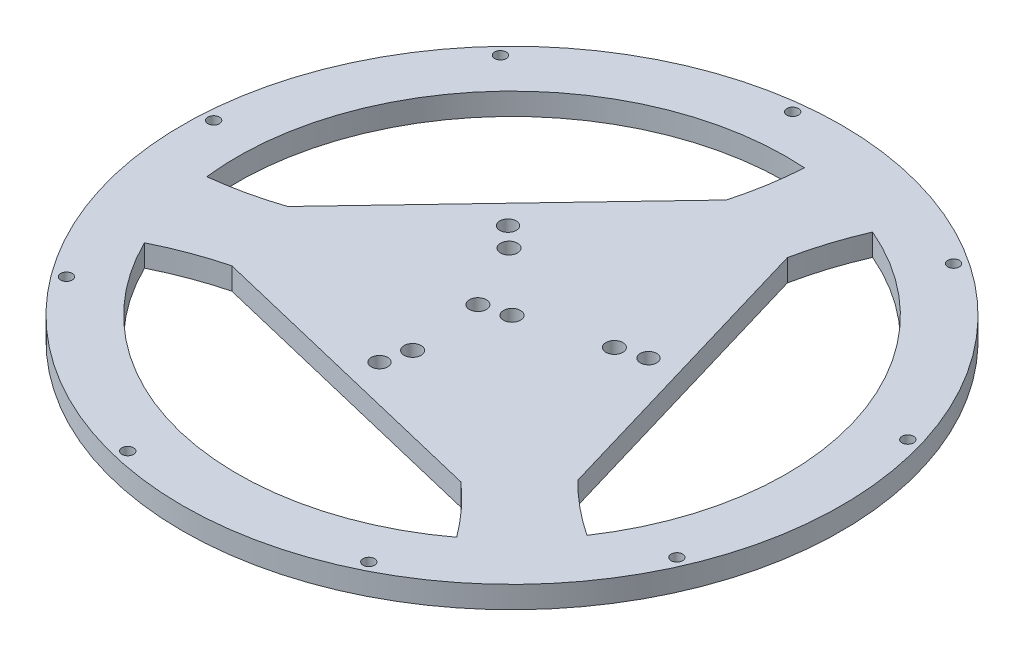
ISO-10303-21;
HEADER;
FILE_DESCRIPTION(('STEP AP214'),'2;1');
FILE_NAME('part.step','',(''),(''),'','','');
FILE_SCHEMA(('AUTOMOTIVE_DESIGN { 1 0 10303 214 1 1 1 1 }'));
ENDSEC;
DATA;
#1=APPLICATION_CONTEXT('core data for automotive mechanical design processes');
#2=APPLICATION_PROTOCOL_DEFINITION('international standard','automotive_design',2000,#1);
#3=PRODUCT_CONTEXT('',#1,'mechanical');
#4=PRODUCT('Part','Part','',(#3));
#5=PRODUCT_RELATED_PRODUCT_CATEGORY('part','',(#4));
#6=PRODUCT_DEFINITION_FORMATION('','',#4);
#7=PRODUCT_DEFINITION_CONTEXT('part definition',#1,'design');
#8=PRODUCT_DEFINITION('design','',#6,#7);
#9=PRODUCT_DEFINITION_SHAPE('','',#8);
#10=(LENGTH_UNIT() NAMED_UNIT(*) SI_UNIT(.MILLI.,.METRE.));
#11=(NAMED_UNIT(*) PLANE_ANGLE_UNIT() SI_UNIT($,.RADIAN.));
#12=(NAMED_UNIT(*) SI_UNIT($,.STERADIAN.) SOLID_ANGLE_UNIT());
#13=UNCERTAINTY_MEASURE_WITH_UNIT(LENGTH_MEASURE(1.E-05),#10,'distance_accuracy_value','');
#14=(GEOMETRIC_REPRESENTATION_CONTEXT(3) GLOBAL_UNCERTAINTY_ASSIGNED_CONTEXT((#13)) GLOBAL_UNIT_ASSIGNED_CONTEXT((#10,
#11,#12)) REPRESENTATION_CONTEXT('',''));
#15=CARTESIAN_POINT('',(0.,0.,0.));
#16=DIRECTION('',(0.,0.,1.));
#17=DIRECTION('',(1.,0.,0.));
#18=AXIS2_PLACEMENT_3D('',#15,#16,#17);
#19=CARTESIAN_POINT('',(0.,4.,0.));
#20=DIRECTION('',(0.,1.,0.));
#21=DIRECTION('',(0.,0.,1.));
#22=AXIS2_PLACEMENT_3D('',#19,#20,#21);
#23=PLANE('',#22);
#24=CARTESIAN_POINT('',(-57.8899742574897,4.,-3.5708375022087));
#25=DIRECTION('',(0.,1.,0.));
#26=DIRECTION('',(0.,0.,1.));
#27=AXIS2_PLACEMENT_3D('',#24,#25,#26);
#28=CIRCLE('',#27,1.05293502772648);
#29=CARTESIAN_POINT('',(-57.8899742574897,4.,-2.51790247448222));
#30=VERTEX_POINT('',#29);
#31=EDGE_CURVE('E515',#30,#30,#28,.F.);
#32=ORIENTED_EDGE('',*,*,#31,.T.);
#33=EDGE_LOOP('',(#32));
#34=FACE_BOUND('',#33,.T.);
#35=CARTESIAN_POINT('',(0.,4.,0.));
#36=DIRECTION('',(0.,1.,0.));
#37=DIRECTION('',(0.,0.,1.));
#38=AXIS2_PLACEMENT_3D('',#35,#36,#37);
#39=CIRCLE('',#38,1.55);
#40=CARTESIAN_POINT('',(0.,4.,1.55));
#41=VERTEX_POINT('',#40);
#42=EDGE_CURVE('E325',#41,#41,#39,.F.);
#43=ORIENTED_EDGE('',*,*,#42,.T.);
#44=EDGE_LOOP('',(#43));
#45=FACE_BOUND('',#44,.T.);
#46=CARTESIAN_POINT('',(-4.79483448116785,4.,1.41759031394963));
#47=DIRECTION('',(0.,1.,0.));
#48=DIRECTION('',(0.,0.,1.));
#49=AXIS2_PLACEMENT_3D('',#46,#47,#48);
#50=CIRCLE('',#49,1.55);
#51=CARTESIAN_POINT('',(-4.79483448116785,4.,2.96759031394963));
#52=VERTEX_POINT('',#51);
#53=EDGE_CURVE('E335',#52,#52,#50,.T.);
#54=ORIENTED_EDGE('',*,*,#53,.F.);
#55=EDGE_LOOP('',(#54));
#56=FACE_BOUND('',#55,.T.);
#57=CARTESIAN_POINT('',(-3.50924404963435,4.,14.5837308738232));
#58=DIRECTION('',(0.,1.,0.));
#59=DIRECTION('',(0.,0.,1.));
#60=AXIS2_PLACEMENT_3D('',#57,#58,#59);
#61=CIRCLE('',#60,1.55);
#62=CARTESIAN_POINT('',(-3.50924404963435,4.,16.1337308738232));
#63=VERTEX_POINT('',#62);
#64=EDGE_CURVE('E347',#63,#63,#61,.T.);
#65=ORIENTED_EDGE('',*,*,#64,.F.);
#66=EDGE_LOOP('',(#65));
#67=FACE_BOUND('',#66,.T.);
#68=CARTESIAN_POINT('',(53.1774832729495,4.,23.1550269435159));
#69=DIRECTION('',(0.,1.,0.));
#70=DIRECTION('',(0.,0.,1.));
#71=AXIS2_PLACEMENT_3D('',#68,#69,#70);
#72=CIRCLE('',#71,1.05293502772553);
#73=CARTESIAN_POINT('',(53.1774832729495,4.,24.2079619712414));
#74=VERTEX_POINT('',#73);
#75=EDGE_CURVE('E359',#74,#74,#72,.T.);
#76=ORIENTED_EDGE('',*,*,#75,.F.);
#77=EDGE_LOOP('',(#76));
#78=FACE_BOUND('',#77,.T.);
#79=CARTESIAN_POINT('',(-13.5690769919208,4.,56.3904260454485));
#80=DIRECTION('',(0.,1.,0.));
#81=DIRECTION('',(0.,0.,1.));
#82=AXIS2_PLACEMENT_3D('',#79,#80,#81);
#83=CIRCLE('',#82,1.05293502772525);
#84=CARTESIAN_POINT('',(-13.5690769919208,4.,57.4433610731738));
#85=VERTEX_POINT('',#84);
#86=EDGE_CURVE('E371',#85,#85,#83,.T.);
#87=ORIENTED_EDGE('',*,*,#86,.F.);
#88=EDGE_LOOP('',(#87));
#89=FACE_BOUND('',#88,.T.);
#90=CARTESIAN_POINT('',(-6.53590007807735,4.,-57.6305648954562));
#91=DIRECTION('',(0.,1.,0.));
#92=DIRECTION('',(0.,0.,1.));
#93=AXIS2_PLACEMENT_3D('',#90,#91,#92);
#94=CIRCLE('',#93,1.05293502772648);
#95=CARTESIAN_POINT('',(-6.53590007807735,4.,-56.5776298677297));
#96=VERTEX_POINT('',#95);
#97=EDGE_CURVE('E383',#96,#96,#94,.T.);
#98=ORIENTED_EDGE('',*,*,#97,.F.);
#99=EDGE_LOOP('',(#98));
#100=FACE_BOUND('',#99,.T.);
#101=CARTESIAN_POINT('',(55.6200799815454,4.,-16.4440476418153));
#102=DIRECTION('',(0.,1.,0.));
#103=DIRECTION('',(0.,0.,1.));
#104=AXIS2_PLACEMENT_3D('',#101,#102,#103);
#105=CIRCLE('',#104,1.05293502772614);
#106=CARTESIAN_POINT('',(55.6200799815454,4.,-15.3911126140892));
#107=VERTEX_POINT('',#106);
#108=EDGE_CURVE('E395',#107,#107,#105,.T.);
#109=ORIENTED_EDGE('',*,*,#108,.F.);
#110=EDGE_LOOP('',(#109));
#111=FACE_BOUND('',#110,.T.);
#112=CARTESIAN_POINT('',(-4.67899206617935,4.,19.444974498431));
#113=DIRECTION('',(0.,1.,0.));
#114=DIRECTION('',(0.,0.,1.));
#115=AXIS2_PLACEMENT_3D('',#112,#113,#114);
#116=CIRCLE('',#115,1.5);
#117=CARTESIAN_POINT('',(-4.67899206617935,4.,20.944974498431));
#118=VERTEX_POINT('',#117);
#119=EDGE_CURVE('E407',#118,#118,#116,.T.);
#120=ORIENTED_EDGE('',*,*,#119,.F.);
#121=EDGE_LOOP('',(#120));
#122=FACE_BOUND('',#121,.T.);
#123=CARTESIAN_POINT('',(0.,4.,0.));
#124=DIRECTION('',(0.,1.,0.));
#125=DIRECTION('',(0.,0.,1.));
#126=AXIS2_PLACEMENT_3D('',#123,#124,#125);
#127=CIRCLE('',#126,50.);
#128=CARTESIAN_POINT('',(41.5155711519758,4.,27.8649843338415));
#129=VERTEX_POINT('',#128);
#130=CARTESIAN_POINT('',(19.6892098874326,4.,-45.9601459311067));
#131=VERTEX_POINT('',#130);
#132=EDGE_CURVE('E453',#129,#131,#127,.T.);
#133=ORIENTED_EDGE('',*,*,#132,.F.);
#134=CARTESIAN_POINT('',(74.7395128137497,4.,-22.0966979882647));
#135=DIRECTION('',(0.,1.,0.));
#136=DIRECTION('',(0.,0.,1.));
#137=AXIS2_PLACEMENT_3D('',#134,#135,#136);
#138=CIRCLE('',#137,60.);
#139=CARTESIAN_POINT('',(31.9813255757251,4.,19.995313416728));
#140=VERTEX_POINT('',#139);
#141=EDGE_CURVE('E451',#140,#129,#138,.T.);
#142=ORIENTED_EDGE('',*,*,#141,.F.);
#143=DIRECTION('',(-0.28351806278993,0.,-0.958966896233569));
#144=VECTOR('',#143,1.);
#145=CARTESIAN_POINT('',(31.9813255757251,4.,19.995313416728));
#146=LINE('',#145,#144);
#147=CARTESIAN_POINT('',(15.967019235954,4.,-34.1712165562232));
#148=VERTEX_POINT('',#147);
#149=EDGE_CURVE('E459',#140,#148,#146,.T.);
#150=ORIENTED_EDGE('',*,*,#149,.T.);
#151=CARTESIAN_POINT('',(74.7395128137497,4.,-22.0966979882647));
#152=DIRECTION('',(0.,1.,0.));
#153=DIRECTION('',(0.,0.,1.));
#154=AXIS2_PLACEMENT_3D('',#151,#152,#153);
#155=CIRCLE('',#154,60.);
#156=EDGE_CURVE('E456',#131,#148,#155,.T.);
#157=ORIENTED_EDGE('',*,*,#156,.F.);
#158=EDGE_LOOP('',(#133,#142,#150,#157));
#159=FACE_BOUND('',#158,.T.);
#160=CARTESIAN_POINT('',(-14.5003458584922,4.,-13.7746132426325));
#161=DIRECTION('',(0.,1.,0.));
#162=DIRECTION('',(0.,0.,1.));
#163=AXIS2_PLACEMENT_3D('',#160,#161,#162);
#164=CIRCLE('',#163,1.5);
#165=CARTESIAN_POINT('',(-14.5003458584922,4.,-12.2746132426325));
#166=VERTEX_POINT('',#165);
#167=EDGE_CURVE('E483',#166,#166,#164,.T.);
#168=ORIENTED_EDGE('',*,*,#167,.F.);
#169=EDGE_LOOP('',(#168));
#170=FACE_BOUND('',#169,.T.);
#171=CARTESIAN_POINT('',(0.,4.,0.));
#172=DIRECTION('',(0.,1.,0.));
#173=DIRECTION('',(0.,0.,1.));
#174=AXIS2_PLACEMENT_3D('',#171,#172,#173);
#175=CIRCLE('',#174,60.);
#176=CARTESIAN_POINT('',(0.,4.,60.));
#177=VERTEX_POINT('',#176);
#178=EDGE_CURVE('E12',#177,#177,#175,.T.);
#179=ORIENTED_EDGE('',*,*,#178,.T.);
#180=EDGE_LOOP('',(#179));
#181=FACE_BOUND('',#180,.T.);
#182=CARTESIAN_POINT('',(-42.0510029896274,4.,-39.9463784036344));
#183=DIRECTION('',(0.,1.,0.));
#184=DIRECTION('',(0.,0.,1.));
#185=AXIS2_PLACEMENT_3D('',#182,#183,#184);
#186=CIRCLE('',#185,1.05293502772648);
#187=CARTESIAN_POINT('',(-42.0510029896274,4.,-38.8934433759079));
#188=VERTEX_POINT('',#187);
#189=EDGE_CURVE('E445',#188,#188,#186,.T.);
#190=ORIENTED_EDGE('',*,*,#189,.F.);
#191=EDGE_LOOP('',(#190));
#192=FACE_BOUND('',#191,.T.);
#193=CARTESIAN_POINT('',(0.,4.,0.));
#194=DIRECTION('',(0.,1.,0.));
#195=DIRECTION('',(0.,0.,1.));
#196=AXIS2_PLACEMENT_3D('',#193,#194,#195);
#197=CIRCLE('',#196,50.);
#198=CARTESIAN_POINT('',(-44.8895698851501,4.,22.0210471033105));
#199=VERTEX_POINT('',#198);
#200=CARTESIAN_POINT('',(29.9580489942619,4.,40.0314289085139));
#201=VERTEX_POINT('',#200);
#202=EDGE_CURVE('E415',#199,#201,#197,.T.);
#203=ORIENTED_EDGE('',*,*,#202,.F.);
#204=CARTESIAN_POINT('',(-18.2334546092855,4.,75.774665757312));
#205=DIRECTION('',(0.,1.,0.));
#206=DIRECTION('',(0.,0.,1.));
#207=AXIS2_PLACEMENT_3D('',#204,#205,#206);
#208=CIRCLE('',#207,60.);
#209=CARTESIAN_POINT('',(-33.3071121633809,4.,17.6989836869147));
#210=VERTEX_POINT('',#209);
#211=EDGE_CURVE('E413',#210,#199,#208,.T.);
#212=ORIENTED_EDGE('',*,*,#211,.F.);
#213=DIRECTION('',(0.972248724921551,0.,0.233949603308958));
#214=VECTOR('',#213,1.);
#215=CARTESIAN_POINT('',(-33.3071121633809,4.,17.6989836869147));
#216=LINE('',#215,#214);
#217=CARTESIAN_POINT('',(21.6096319979315,4.,30.9134525591627));
#218=VERTEX_POINT('',#217);
#219=EDGE_CURVE('E421',#210,#218,#216,.T.);
#220=ORIENTED_EDGE('',*,*,#219,.T.);
#221=CARTESIAN_POINT('',(-18.2334546092855,4.,75.774665757312));
#222=DIRECTION('',(0.,1.,0.));
#223=DIRECTION('',(0.,0.,1.));
#224=AXIS2_PLACEMENT_3D('',#221,#222,#223);
#225=CIRCLE('',#224,60.);
#226=EDGE_CURVE('E418',#201,#218,#225,.T.);
#227=ORIENTED_EDGE('',*,*,#226,.F.);
#228=EDGE_LOOP('',(#203,#212,#220,#227));
#229=FACE_BOUND('',#228,.T.);
#230=CARTESIAN_POINT('',(19.1793379246714,4.,-5.67036125579842));
#231=DIRECTION('',(0.,1.,0.));
#232=DIRECTION('',(0.,0.,1.));
#233=AXIS2_PLACEMENT_3D('',#230,#231,#232);
#234=CIRCLE('',#233,1.5);
#235=CARTESIAN_POINT('',(19.1793379246714,4.,-4.17036125579842));
#236=VERTEX_POINT('',#235);
#237=EDGE_CURVE('E401',#236,#236,#234,.T.);
#238=ORIENTED_EDGE('',*,*,#237,.F.);
#239=EDGE_LOOP('',(#238));
#240=FACE_BOUND('',#239,.T.);
#241=CARTESIAN_POINT('',(32.037423118442,4.,-48.3487695803088));
#242=DIRECTION('',(0.,1.,0.));
#243=DIRECTION('',(0.,0.,1.));
#244=AXIS2_PLACEMENT_3D('',#241,#242,#243);
#245=CIRCLE('',#244,1.05293502772665);
#246=CARTESIAN_POINT('',(32.037423118442,4.,-47.2958345525821));
#247=VERTEX_POINT('',#246);
#248=EDGE_CURVE('E389',#247,#247,#245,.T.);
#249=ORIENTED_EDGE('',*,*,#248,.F.);
#250=EDGE_LOOP('',(#249));
#251=FACE_BOUND('',#250,.T.);
#252=CARTESIAN_POINT('',(-46.6415831948744,4.,34.4755379519386));
#253=DIRECTION('',(0.,1.,0.));
#254=DIRECTION('',(0.,0.,1.));
#255=AXIS2_PLACEMENT_3D('',#252,#253,#254);
#256=CIRCLE('',#255,1.05293502772574);
#257=CARTESIAN_POINT('',(-46.6415831948744,4.,35.5284729796644));
#258=VERTEX_POINT('',#257);
#259=EDGE_CURVE('E377',#258,#258,#256,.T.);
#260=ORIENTED_EDGE('',*,*,#259,.F.);
#261=EDGE_LOOP('',(#260));
#262=FACE_BOUND('',#261,.T.);
#263=CARTESIAN_POINT('',(25.8525511390449,4.,51.9196070825162));
#264=DIRECTION('',(0.,1.,0.));
#265=DIRECTION('',(0.,0.,1.));
#266=AXIS2_PLACEMENT_3D('',#263,#264,#265);
#267=CIRCLE('',#266,1.05293502772513);
#268=CARTESIAN_POINT('',(25.8525511390449,4.,52.9725421102413));
#269=VERTEX_POINT('',#268);
#270=EDGE_CURVE('E365',#269,#269,#267,.T.);
#271=ORIENTED_EDGE('',*,*,#270,.F.);
#272=EDGE_LOOP('',(#271));
#273=FACE_BOUND('',#272,.T.);
#274=CARTESIAN_POINT('',(-10.8752593938691,4.,-10.3309599319745));
#275=DIRECTION('',(0.,1.,0.));
#276=DIRECTION('',(0.,0.,1.));
#277=AXIS2_PLACEMENT_3D('',#274,#275,#276);
#278=CIRCLE('',#277,1.55);
#279=CARTESIAN_POINT('',(-10.8752593938691,4.,-8.78095993197445));
#280=VERTEX_POINT('',#279);
#281=EDGE_CURVE('E353',#280,#280,#278,.T.);
#282=ORIENTED_EDGE('',*,*,#281,.F.);
#283=EDGE_LOOP('',(#282));
#284=FACE_BOUND('',#283,.T.);
#285=CARTESIAN_POINT('',(14.3845034435036,4.,-4.2527709418489));
#286=DIRECTION('',(0.,1.,0.));
#287=DIRECTION('',(0.,0.,1.));
#288=AXIS2_PLACEMENT_3D('',#285,#286,#287);
#289=CIRCLE('',#288,1.55);
#290=CARTESIAN_POINT('',(14.3845034435036,4.,-2.7027709418489));
#291=VERTEX_POINT('',#290);
#292=EDGE_CURVE('E341',#291,#291,#289,.T.);
#293=ORIENTED_EDGE('',*,*,#292,.F.);
#294=EDGE_LOOP('',(#293));
#295=FACE_BOUND('',#294,.T.);
#296=DIRECTION('',(-0.688730662131619,0.,0.725017292924618));
#297=VECTOR('',#296,1.);
#298=CARTESIAN_POINT('',(-18.1254323231156,4.,-17.2182665532906));
#299=LINE('',#298,#297);
#300=CARTESIAN_POINT('',(1.32578658765488,4.,-37.6942971036422));
#301=VERTEX_POINT('',#300);
#302=CARTESIAN_POINT('',(-37.5766512338855,4.,3.25776399706044));
#303=VERTEX_POINT('',#302);
#304=EDGE_CURVE('E309',#301,#303,#299,.T.);
#305=ORIENTED_EDGE('',*,*,#304,.T.);
#306=CARTESIAN_POINT('',(-56.5060582044648,4.,-53.6779677690472));
#307=DIRECTION('',(0.,1.,0.));
#308=DIRECTION('',(0.,0.,1.));
#309=AXIS2_PLACEMENT_3D('',#306,#307,#308);
#310=CIRCLE('',#309,59.9999999999999);
#311=CARTESIAN_POINT('',(-49.6472588816947,4.,5.92871702259306));
#312=VERTEX_POINT('',#311);
#313=EDGE_CURVE('E319',#312,#303,#310,.T.);
#314=ORIENTED_EDGE('',*,*,#313,.F.);
#315=CARTESIAN_POINT('',(0.,4.,0.));
#316=DIRECTION('',(0.,1.,0.));
#317=DIRECTION('',(0.,0.,1.));
#318=AXIS2_PLACEMENT_3D('',#315,#316,#317);
#319=CIRCLE('',#318,50.);
#320=CARTESIAN_POINT('',(3.37399873317395,4.,-49.8860314371522));
#321=VERTEX_POINT('',#320);
#322=EDGE_CURVE('E317',#321,#312,#319,.T.);
#323=ORIENTED_EDGE('',*,*,#322,.F.);
#324=CARTESIAN_POINT('',(-56.5060582044648,4.,-53.6779677690472));
#325=DIRECTION('',(0.,1.,0.));
#326=DIRECTION('',(0.,0.,1.));
#327=AXIS2_PLACEMENT_3D('',#324,#325,#326);
#328=CIRCLE('',#327,60.);
#329=EDGE_CURVE('E301',#301,#321,#328,.T.);
#330=ORIENTED_EDGE('',*,*,#329,.F.);
#331=EDGE_LOOP('',(#305,#314,#323,#330));
#332=FACE_BOUND('',#331,.T.);
#333=ADVANCED_FACE('F208',(#34,#45,#56,#67,#78,#89,#100,#111,#122,#159,#170,#181,#192,#229,#240,
#251,#262,#273,#284,#295,#332),#23,.T.);
#334=CARTESIAN_POINT('',(0.,0.,0.));
#335=DIRECTION('',(0.,1.,0.));
#336=DIRECTION('',(0.,0.,1.));
#337=AXIS2_PLACEMENT_3D('',#334,#335,#336);
#338=PLANE('',#337);
#339=CARTESIAN_POINT('',(-57.8899742574897,0.,-3.5708375022087));
#340=DIRECTION('',(0.,1.,0.));
#341=DIRECTION('',(0.,0.,1.));
#342=AXIS2_PLACEMENT_3D('',#339,#340,#341);
#343=CIRCLE('',#342,1.05293502772648);
#344=CARTESIAN_POINT('',(-57.8899742574897,0.,-2.51790247448222));
#345=VERTEX_POINT('',#344);
#346=EDGE_CURVE('E808',#345,#345,#343,.T.);
#347=ORIENTED_EDGE('',*,*,#346,.T.);
#348=EDGE_LOOP('',(#347));
#349=FACE_BOUND('',#348,.T.);
#350=CARTESIAN_POINT('',(0.,0.,0.));
#351=DIRECTION('',(0.,1.,0.));
#352=DIRECTION('',(0.,0.,1.));
#353=AXIS2_PLACEMENT_3D('',#350,#351,#352);
#354=CIRCLE('',#353,1.55);
#355=CARTESIAN_POINT('',(0.,0.,1.55));
#356=VERTEX_POINT('',#355);
#357=EDGE_CURVE('E810',#356,#356,#354,.T.);
#358=ORIENTED_EDGE('',*,*,#357,.T.);
#359=EDGE_LOOP('',(#358));
#360=FACE_BOUND('',#359,.T.);
#361=CARTESIAN_POINT('',(-42.0510029896274,0.,-39.9463784036344));
#362=DIRECTION('',(0.,1.,0.));
#363=DIRECTION('',(0.,0.,1.));
#364=AXIS2_PLACEMENT_3D('',#361,#362,#363);
#365=CIRCLE('',#364,1.05293502772648);
#366=CARTESIAN_POINT('',(-42.0510029896274,0.,-38.8934433759079));
#367=VERTEX_POINT('',#366);
#368=EDGE_CURVE('E444',#367,#367,#365,.T.);
#369=ORIENTED_EDGE('',*,*,#368,.T.);
#370=EDGE_LOOP('',(#369));
#371=FACE_BOUND('',#370,.T.);
#372=CARTESIAN_POINT('',(74.7395128137497,0.,-22.0966979882647));
#373=DIRECTION('',(0.,1.,0.));
#374=DIRECTION('',(0.,0.,1.));
#375=AXIS2_PLACEMENT_3D('',#372,#373,#374);
#376=CIRCLE('',#375,60.);
#377=CARTESIAN_POINT('',(31.9813255757251,0.,19.995313416728));
#378=VERTEX_POINT('',#377);
#379=CARTESIAN_POINT('',(41.5155711519758,0.,27.8649843338415));
#380=VERTEX_POINT('',#379);
#381=EDGE_CURVE('E448',#378,#380,#376,.T.);
#382=ORIENTED_EDGE('',*,*,#381,.T.);
#383=CARTESIAN_POINT('',(0.,0.,0.));
#384=DIRECTION('',(0.,1.,0.));
#385=DIRECTION('',(0.,0.,1.));
#386=AXIS2_PLACEMENT_3D('',#383,#384,#385);
#387=CIRCLE('',#386,50.);
#388=CARTESIAN_POINT('',(19.6892098874326,0.,-45.9601459311067));
#389=VERTEX_POINT('',#388);
#390=EDGE_CURVE('E465',#380,#389,#387,.T.);
#391=ORIENTED_EDGE('',*,*,#390,.T.);
#392=CARTESIAN_POINT('',(74.7395128137497,0.,-22.0966979882647));
#393=DIRECTION('',(0.,1.,0.));
#394=DIRECTION('',(0.,0.,1.));
#395=AXIS2_PLACEMENT_3D('',#392,#393,#394);
#396=CIRCLE('',#395,60.);
#397=CARTESIAN_POINT('',(15.967019235954,0.,-34.1712165562232));
#398=VERTEX_POINT('',#397);
#399=EDGE_CURVE('E468',#389,#398,#396,.T.);
#400=ORIENTED_EDGE('',*,*,#399,.T.);
#401=DIRECTION('',(-0.28351806278993,0.,-0.958966896233569));
#402=VECTOR('',#401,1.);
#403=CARTESIAN_POINT('',(31.9813255757251,0.,19.995313416728));
#404=LINE('',#403,#402);
#405=EDGE_CURVE('E454',#378,#398,#404,.T.);
#406=ORIENTED_EDGE('',*,*,#405,.F.);
#407=EDGE_LOOP('',(#382,#391,#400,#406));
#408=FACE_BOUND('',#407,.T.);
#409=CARTESIAN_POINT('',(0.,0.,0.));
#410=DIRECTION('',(0.,1.,0.));
#411=DIRECTION('',(0.,0.,1.));
#412=AXIS2_PLACEMENT_3D('',#409,#410,#411);
#413=CIRCLE('',#412,60.);
#414=CARTESIAN_POINT('',(0.,0.,60.));
#415=VERTEX_POINT('',#414);
#416=EDGE_CURVE('E212',#415,#415,#413,.T.);
#417=ORIENTED_EDGE('',*,*,#416,.F.);
#418=EDGE_LOOP('',(#417));
#419=FACE_BOUND('',#418,.T.);
#420=CARTESIAN_POINT('',(-14.5003458584922,0.,-13.7746132426325));
#421=DIRECTION('',(0.,1.,0.));
#422=DIRECTION('',(0.,0.,1.));
#423=AXIS2_PLACEMENT_3D('',#420,#421,#422);
#424=CIRCLE('',#423,1.5);
#425=CARTESIAN_POINT('',(-14.5003458584922,0.,-12.2746132426325));
#426=VERTEX_POINT('',#425);
#427=EDGE_CURVE('E482',#426,#426,#424,.T.);
#428=ORIENTED_EDGE('',*,*,#427,.T.);
#429=EDGE_LOOP('',(#428));
#430=FACE_BOUND('',#429,.T.);
#431=CARTESIAN_POINT('',(-18.2334546092855,0.,75.774665757312));
#432=DIRECTION('',(0.,1.,0.));
#433=DIRECTION('',(0.,0.,1.));
#434=AXIS2_PLACEMENT_3D('',#431,#432,#433);
#435=CIRCLE('',#434,60.);
#436=CARTESIAN_POINT('',(-33.3071121633809,0.,17.6989836869147));
#437=VERTEX_POINT('',#436);
#438=CARTESIAN_POINT('',(-44.8895698851501,0.,22.0210471033105));
#439=VERTEX_POINT('',#438);
#440=EDGE_CURVE('E410',#437,#439,#435,.T.);
#441=ORIENTED_EDGE('',*,*,#440,.T.);
#442=CARTESIAN_POINT('',(0.,0.,0.));
#443=DIRECTION('',(0.,1.,0.));
#444=DIRECTION('',(0.,0.,1.));
#445=AXIS2_PLACEMENT_3D('',#442,#443,#444);
#446=CIRCLE('',#445,50.);
#447=CARTESIAN_POINT('',(29.9580489942619,0.,40.0314289085139));
#448=VERTEX_POINT('',#447);
#449=EDGE_CURVE('E427',#439,#448,#446,.T.);
#450=ORIENTED_EDGE('',*,*,#449,.T.);
#451=CARTESIAN_POINT('',(-18.2334546092855,0.,75.774665757312));
#452=DIRECTION('',(0.,1.,0.));
#453=DIRECTION('',(0.,0.,1.));
#454=AXIS2_PLACEMENT_3D('',#451,#452,#453);
#455=CIRCLE('',#454,60.);
#456=CARTESIAN_POINT('',(21.6096319979315,0.,30.9134525591627));
#457=VERTEX_POINT('',#456);
#458=EDGE_CURVE('E430',#448,#457,#455,.T.);
#459=ORIENTED_EDGE('',*,*,#458,.T.);
#460=DIRECTION('',(0.972248724921551,0.,0.233949603308958));
#461=VECTOR('',#460,1.);
#462=CARTESIAN_POINT('',(-33.3071121633809,0.,17.6989836869147));
#463=LINE('',#462,#461);
#464=EDGE_CURVE('E416',#437,#457,#463,.T.);
#465=ORIENTED_EDGE('',*,*,#464,.F.);
#466=EDGE_LOOP('',(#441,#450,#459,#465));
#467=FACE_BOUND('',#466,.T.);
#468=CARTESIAN_POINT('',(-4.67899206617935,0.,19.444974498431));
#469=DIRECTION('',(0.,1.,0.));
#470=DIRECTION('',(0.,0.,1.));
#471=AXIS2_PLACEMENT_3D('',#468,#469,#470);
#472=CIRCLE('',#471,1.5);
#473=CARTESIAN_POINT('',(-4.67899206617935,0.,20.944974498431));
#474=VERTEX_POINT('',#473);
#475=EDGE_CURVE('E404',#474,#474,#472,.T.);
#476=ORIENTED_EDGE('',*,*,#475,.T.);
#477=EDGE_LOOP('',(#476));
#478=FACE_BOUND('',#477,.T.);
#479=CARTESIAN_POINT('',(19.1793379246714,0.,-5.67036125579842));
#480=DIRECTION('',(0.,1.,0.));
#481=DIRECTION('',(0.,0.,1.));
#482=AXIS2_PLACEMENT_3D('',#479,#480,#481);
#483=CIRCLE('',#482,1.5);
#484=CARTESIAN_POINT('',(19.1793379246714,0.,-4.17036125579842));
#485=VERTEX_POINT('',#484);
#486=EDGE_CURVE('E398',#485,#485,#483,.T.);
#487=ORIENTED_EDGE('',*,*,#486,.T.);
#488=EDGE_LOOP('',(#487));
#489=FACE_BOUND('',#488,.T.);
#490=CARTESIAN_POINT('',(55.6200799815454,0.,-16.4440476418153));
#491=DIRECTION('',(0.,1.,0.));
#492=DIRECTION('',(0.,0.,1.));
#493=AXIS2_PLACEMENT_3D('',#490,#491,#492);
#494=CIRCLE('',#493,1.05293502772614);
#495=CARTESIAN_POINT('',(55.6200799815454,0.,-15.3911126140892));
#496=VERTEX_POINT('',#495);
#497=EDGE_CURVE('E392',#496,#496,#494,.T.);
#498=ORIENTED_EDGE('',*,*,#497,.T.);
#499=EDGE_LOOP('',(#498));
#500=FACE_BOUND('',#499,.T.);
#501=CARTESIAN_POINT('',(32.037423118442,0.,-48.3487695803088));
#502=DIRECTION('',(0.,1.,0.));
#503=DIRECTION('',(0.,0.,1.));
#504=AXIS2_PLACEMENT_3D('',#501,#502,#503);
#505=CIRCLE('',#504,1.05293502772665);
#506=CARTESIAN_POINT('',(32.037423118442,0.,-47.2958345525821));
#507=VERTEX_POINT('',#506);
#508=EDGE_CURVE('E386',#507,#507,#505,.T.);
#509=ORIENTED_EDGE('',*,*,#508,.T.);
#510=EDGE_LOOP('',(#509));
#511=FACE_BOUND('',#510,.T.);
#512=CARTESIAN_POINT('',(-6.53590007807735,0.,-57.6305648954562));
#513=DIRECTION('',(0.,1.,0.));
#514=DIRECTION('',(0.,0.,1.));
#515=AXIS2_PLACEMENT_3D('',#512,#513,#514);
#516=CIRCLE('',#515,1.05293502772648);
#517=CARTESIAN_POINT('',(-6.53590007807735,0.,-56.5776298677297));
#518=VERTEX_POINT('',#517);
#519=EDGE_CURVE('E380',#518,#518,#516,.T.);
#520=ORIENTED_EDGE('',*,*,#519,.T.);
#521=EDGE_LOOP('',(#520));
#522=FACE_BOUND('',#521,.T.);
#523=CARTESIAN_POINT('',(-46.6415831948744,0.,34.4755379519386));
#524=DIRECTION('',(0.,1.,0.));
#525=DIRECTION('',(0.,0.,1.));
#526=AXIS2_PLACEMENT_3D('',#523,#524,#525);
#527=CIRCLE('',#526,1.05293502772574);
#528=CARTESIAN_POINT('',(-46.6415831948744,0.,35.5284729796644));
#529=VERTEX_POINT('',#528);
#530=EDGE_CURVE('E374',#529,#529,#527,.T.);
#531=ORIENTED_EDGE('',*,*,#530,.T.);
#532=EDGE_LOOP('',(#531));
#533=FACE_BOUND('',#532,.T.);
#534=CARTESIAN_POINT('',(-13.5690769919208,0.,56.3904260454485));
#535=DIRECTION('',(0.,1.,0.));
#536=DIRECTION('',(0.,0.,1.));
#537=AXIS2_PLACEMENT_3D('',#534,#535,#536);
#538=CIRCLE('',#537,1.05293502772525);
#539=CARTESIAN_POINT('',(-13.5690769919208,0.,57.4433610731738));
#540=VERTEX_POINT('',#539);
#541=EDGE_CURVE('E368',#540,#540,#538,.T.);
#542=ORIENTED_EDGE('',*,*,#541,.T.);
#543=EDGE_LOOP('',(#542));
#544=FACE_BOUND('',#543,.T.);
#545=CARTESIAN_POINT('',(25.8525511390449,0.,51.9196070825162));
#546=DIRECTION('',(0.,1.,0.));
#547=DIRECTION('',(0.,0.,1.));
#548=AXIS2_PLACEMENT_3D('',#545,#546,#547);
#549=CIRCLE('',#548,1.05293502772513);
#550=CARTESIAN_POINT('',(25.8525511390449,0.,52.9725421102413));
#551=VERTEX_POINT('',#550);
#552=EDGE_CURVE('E362',#551,#551,#549,.T.);
#553=ORIENTED_EDGE('',*,*,#552,.T.);
#554=EDGE_LOOP('',(#553));
#555=FACE_BOUND('',#554,.T.);
#556=CARTESIAN_POINT('',(53.1774832729495,0.,23.1550269435159));
#557=DIRECTION('',(0.,1.,0.));
#558=DIRECTION('',(0.,0.,1.));
#559=AXIS2_PLACEMENT_3D('',#556,#557,#558);
#560=CIRCLE('',#559,1.05293502772553);
#561=CARTESIAN_POINT('',(53.1774832729495,0.,24.2079619712414));
#562=VERTEX_POINT('',#561);
#563=EDGE_CURVE('E356',#562,#562,#560,.T.);
#564=ORIENTED_EDGE('',*,*,#563,.T.);
#565=EDGE_LOOP('',(#564));
#566=FACE_BOUND('',#565,.T.);
#567=CARTESIAN_POINT('',(-10.8752593938691,0.,-10.3309599319745));
#568=DIRECTION('',(0.,1.,0.));
#569=DIRECTION('',(0.,0.,1.));
#570=AXIS2_PLACEMENT_3D('',#567,#568,#569);
#571=CIRCLE('',#570,1.55);
#572=CARTESIAN_POINT('',(-10.8752593938691,0.,-8.78095993197445));
#573=VERTEX_POINT('',#572);
#574=EDGE_CURVE('E350',#573,#573,#571,.T.);
#575=ORIENTED_EDGE('',*,*,#574,.T.);
#576=EDGE_LOOP('',(#575));
#577=FACE_BOUND('',#576,.T.);
#578=CARTESIAN_POINT('',(-3.50924404963435,0.,14.5837308738232));
#579=DIRECTION('',(0.,1.,0.));
#580=DIRECTION('',(0.,0.,1.));
#581=AXIS2_PLACEMENT_3D('',#578,#579,#580);
#582=CIRCLE('',#581,1.55);
#583=CARTESIAN_POINT('',(-3.50924404963435,0.,16.1337308738232));
#584=VERTEX_POINT('',#583);
#585=EDGE_CURVE('E344',#584,#584,#582,.T.);
#586=ORIENTED_EDGE('',*,*,#585,.T.);
#587=EDGE_LOOP('',(#586));
#588=FACE_BOUND('',#587,.T.);
#589=CARTESIAN_POINT('',(14.3845034435036,0.,-4.2527709418489));
#590=DIRECTION('',(0.,1.,0.));
#591=DIRECTION('',(0.,0.,1.));
#592=AXIS2_PLACEMENT_3D('',#589,#590,#591);
#593=CIRCLE('',#592,1.55);
#594=CARTESIAN_POINT('',(14.3845034435036,0.,-2.7027709418489));
#595=VERTEX_POINT('',#594);
#596=EDGE_CURVE('E338',#595,#595,#593,.T.);
#597=ORIENTED_EDGE('',*,*,#596,.T.);
#598=EDGE_LOOP('',(#597));
#599=FACE_BOUND('',#598,.T.);
#600=CARTESIAN_POINT('',(-4.79483448116785,0.,1.41759031394963));
#601=DIRECTION('',(0.,1.,0.));
#602=DIRECTION('',(0.,0.,1.));
#603=AXIS2_PLACEMENT_3D('',#600,#601,#602);
#604=CIRCLE('',#603,1.55);
#605=CARTESIAN_POINT('',(-4.79483448116785,0.,2.96759031394963));
#606=VERTEX_POINT('',#605);
#607=EDGE_CURVE('E305',#606,#606,#604,.T.);
#608=ORIENTED_EDGE('',*,*,#607,.T.);
#609=EDGE_LOOP('',(#608));
#610=FACE_BOUND('',#609,.T.);
#611=CARTESIAN_POINT('',(-56.5060582044648,0.,-53.6779677690472));
#612=DIRECTION('',(0.,1.,0.));
#613=DIRECTION('',(0.,0.,1.));
#614=AXIS2_PLACEMENT_3D('',#611,#612,#613);
#615=CIRCLE('',#614,59.9999999999999);
#616=CARTESIAN_POINT('',(-49.6472588816947,0.,5.92871702259318));
#617=VERTEX_POINT('',#616);
#618=CARTESIAN_POINT('',(-37.5766512338854,0.,3.25776399706055));
#619=VERTEX_POINT('',#618);
#620=EDGE_CURVE('E314',#617,#619,#615,.T.);
#621=ORIENTED_EDGE('',*,*,#620,.T.);
#622=DIRECTION('',(-0.688730662131619,0.,0.725017292924618));
#623=VECTOR('',#622,1.);
#624=CARTESIAN_POINT('',(-18.1254323231156,0.,-17.2182665532906));
#625=LINE('',#624,#623);
#626=CARTESIAN_POINT('',(1.32578658765488,0.,-37.6942971036422));
#627=VERTEX_POINT('',#626);
#628=EDGE_CURVE('E231',#627,#619,#625,.T.);
#629=ORIENTED_EDGE('',*,*,#628,.F.);
#630=CARTESIAN_POINT('',(-56.5060582044648,0.,-53.6779677690472));
#631=DIRECTION('',(0.,1.,0.));
#632=DIRECTION('',(0.,0.,1.));
#633=AXIS2_PLACEMENT_3D('',#630,#631,#632);
#634=CIRCLE('',#633,60.);
#635=CARTESIAN_POINT('',(3.37399873317395,0.,-49.8860314371522));
#636=VERTEX_POINT('',#635);
#637=EDGE_CURVE('E304',#627,#636,#634,.T.);
#638=ORIENTED_EDGE('',*,*,#637,.T.);
#639=CARTESIAN_POINT('',(0.,0.,0.));
#640=DIRECTION('',(0.,1.,0.));
#641=DIRECTION('',(0.,0.,1.));
#642=AXIS2_PLACEMENT_3D('',#639,#640,#641);
#643=CIRCLE('',#642,50.);
#644=EDGE_CURVE('E327',#636,#617,#643,.T.);
#645=ORIENTED_EDGE('',*,*,#644,.T.);
#646=EDGE_LOOP('',(#621,#629,#638,#645));
#647=FACE_BOUND('',#646,.T.);
#648=ADVANCED_FACE('F489',(#349,#360,#371,#408,#419,#430,#467,#478,#489,#500,#511,#522,#533,
#544,#555,#566,#577,#588,#599,#610,#647),#338,.F.);
#649=CARTESIAN_POINT('',(0.,4.,0.));
#650=DIRECTION('',(0.,-1.,0.));
#651=DIRECTION('',(0.,0.,-1.));
#652=AXIS2_PLACEMENT_3D('',#649,#650,#651);
#653=CYLINDRICAL_SURFACE('',#652,60.);
#654=ORIENTED_EDGE('',*,*,#178,.F.);
#655=EDGE_LOOP('',(#654));
#656=FACE_BOUND('',#655,.T.);
#657=ORIENTED_EDGE('',*,*,#416,.T.);
#658=EDGE_LOOP('',(#657));
#659=FACE_BOUND('',#658,.T.);
#660=ADVANCED_FACE('F210',(#656,#659),#653,.T.);
#661=CARTESIAN_POINT('',(-14.5003458584922,4.,-13.7746132426325));
#662=DIRECTION('',(0.,-1.,0.));
#663=DIRECTION('',(0.,0.,-1.));
#664=AXIS2_PLACEMENT_3D('',#661,#662,#663);
#665=CYLINDRICAL_SURFACE('',#664,1.5);
#666=ORIENTED_EDGE('',*,*,#167,.T.);
#667=EDGE_LOOP('',(#666));
#668=FACE_BOUND('',#667,.T.);
#669=ORIENTED_EDGE('',*,*,#427,.F.);
#670=EDGE_LOOP('',(#669));
#671=FACE_BOUND('',#670,.T.);
#672=ADVANCED_FACE('F492',(#668,#671),#665,.F.);
#673=CARTESIAN_POINT('',(74.7395128137497,4.,-22.0966979882647));
#674=DIRECTION('',(0.,-1.,0.));
#675=DIRECTION('',(0.,0.,-1.));
#676=AXIS2_PLACEMENT_3D('',#673,#674,#675);
#677=CYLINDRICAL_SURFACE('',#676,60.);
#678=ORIENTED_EDGE('',*,*,#381,.F.);
#679=DIRECTION('',(0.,-1.,0.));
#680=VECTOR('',#679,1.);
#681=CARTESIAN_POINT('',(31.9813255757251,4.,19.995313416728));
#682=LINE('',#681,#680);
#683=EDGE_CURVE('E462',#140,#378,#682,.T.);
#684=ORIENTED_EDGE('',*,*,#683,.F.);
#685=ORIENTED_EDGE('',*,*,#141,.T.);
#686=DIRECTION('',(0.,-1.,0.));
#687=VECTOR('',#686,1.);
#688=CARTESIAN_POINT('',(41.5155711519758,4.,27.8649843338415));
#689=LINE('',#688,#687);
#690=EDGE_CURVE('E479',#129,#380,#689,.T.);
#691=ORIENTED_EDGE('',*,*,#690,.T.);
#692=EDGE_LOOP('',(#678,#684,#685,#691));
#693=FACE_BOUND('',#692,.T.);
#694=ADVANCED_FACE('F494',(#693),#677,.F.);
#695=CARTESIAN_POINT('',(0.,4.,0.));
#696=DIRECTION('',(0.,-1.,0.));
#697=DIRECTION('',(0.,0.,-1.));
#698=AXIS2_PLACEMENT_3D('',#695,#696,#697);
#699=CYLINDRICAL_SURFACE('',#698,50.);
#700=ORIENTED_EDGE('',*,*,#390,.F.);
#701=ORIENTED_EDGE('',*,*,#690,.F.);
#702=ORIENTED_EDGE('',*,*,#132,.T.);
#703=DIRECTION('',(0.,-1.,0.));
#704=VECTOR('',#703,1.);
#705=CARTESIAN_POINT('',(19.6892098874326,4.,-45.9601459311067));
#706=LINE('',#705,#704);
#707=EDGE_CURVE('E477',#131,#389,#706,.T.);
#708=ORIENTED_EDGE('',*,*,#707,.T.);
#709=EDGE_LOOP('',(#700,#701,#702,#708));
#710=FACE_BOUND('',#709,.T.);
#711=ADVANCED_FACE('F501',(#710),#699,.F.);
#712=CARTESIAN_POINT('',(74.7395128137497,4.,-22.0966979882647));
#713=DIRECTION('',(0.,-1.,0.));
#714=DIRECTION('',(0.,0.,-1.));
#715=AXIS2_PLACEMENT_3D('',#712,#713,#714);
#716=CYLINDRICAL_SURFACE('',#715,60.);
#717=ORIENTED_EDGE('',*,*,#399,.F.);
#718=ORIENTED_EDGE('',*,*,#707,.F.);
#719=ORIENTED_EDGE('',*,*,#156,.T.);
#720=DIRECTION('',(0.,-1.,0.));
#721=VECTOR('',#720,1.);
#722=CARTESIAN_POINT('',(15.967019235954,4.,-34.1712165562232));
#723=LINE('',#722,#721);
#724=EDGE_CURVE('E475',#148,#398,#723,.T.);
#725=ORIENTED_EDGE('',*,*,#724,.T.);
#726=EDGE_LOOP('',(#717,#718,#719,#725));
#727=FACE_BOUND('',#726,.T.);
#728=ADVANCED_FACE('F660',(#727),#716,.F.);
#729=CARTESIAN_POINT('',(31.9813255757251,4.,19.995313416728));
#730=DIRECTION('',(-0.958966896233569,0.,0.28351806278993));
#731=DIRECTION('',(0.28351806278993,0.,0.958966896233569));
#732=AXIS2_PLACEMENT_3D('',#729,#730,#731);
#733=PLANE('',#732);
#734=ORIENTED_EDGE('',*,*,#405,.T.);
#735=ORIENTED_EDGE('',*,*,#724,.F.);
#736=ORIENTED_EDGE('',*,*,#149,.F.);
#737=ORIENTED_EDGE('',*,*,#683,.T.);
#738=EDGE_LOOP('',(#734,#735,#736,#737));
#739=FACE_BOUND('',#738,.T.);
#740=ADVANCED_FACE('F656',(#739),#733,.F.);
#741=CARTESIAN_POINT('',(-42.0510029896274,4.,-39.9463784036344));
#742=DIRECTION('',(0.,-1.,0.));
#743=DIRECTION('',(0.,0.,-1.));
#744=AXIS2_PLACEMENT_3D('',#741,#742,#743);
#745=CYLINDRICAL_SURFACE('',#744,1.05293502772648);
#746=ORIENTED_EDGE('',*,*,#189,.T.);
#747=EDGE_LOOP('',(#746));
#748=FACE_BOUND('',#747,.T.);
#749=ORIENTED_EDGE('',*,*,#368,.F.);
#750=EDGE_LOOP('',(#749));
#751=FACE_BOUND('',#750,.T.);
#752=ADVANCED_FACE('F652',(#748,#751),#745,.F.);
#753=CARTESIAN_POINT('',(-18.2334546092855,4.,75.774665757312));
#754=DIRECTION('',(0.,-1.,0.));
#755=DIRECTION('',(0.,0.,-1.));
#756=AXIS2_PLACEMENT_3D('',#753,#754,#755);
#757=CYLINDRICAL_SURFACE('',#756,60.);
#758=ORIENTED_EDGE('',*,*,#440,.F.);
#759=DIRECTION('',(0.,-1.,0.));
#760=VECTOR('',#759,1.);
#761=CARTESIAN_POINT('',(-33.3071121633809,4.,17.6989836869147));
#762=LINE('',#761,#760);
#763=EDGE_CURVE('E424',#210,#437,#762,.T.);
#764=ORIENTED_EDGE('',*,*,#763,.F.);
#765=ORIENTED_EDGE('',*,*,#211,.T.);
#766=DIRECTION('',(0.,-1.,0.));
#767=VECTOR('',#766,1.);
#768=CARTESIAN_POINT('',(-44.8895698851501,4.,22.0210471033105));
#769=LINE('',#768,#767);
#770=EDGE_CURVE('E441',#199,#439,#769,.T.);
#771=ORIENTED_EDGE('',*,*,#770,.T.);
#772=EDGE_LOOP('',(#758,#764,#765,#771));
#773=FACE_BOUND('',#772,.T.);
#774=ADVANCED_FACE('F648',(#773),#757,.F.);
#775=CARTESIAN_POINT('',(0.,4.,0.));
#776=DIRECTION('',(0.,-1.,0.));
#777=DIRECTION('',(0.,0.,-1.));
#778=AXIS2_PLACEMENT_3D('',#775,#776,#777);
#779=CYLINDRICAL_SURFACE('',#778,50.);
#780=ORIENTED_EDGE('',*,*,#449,.F.);
#781=ORIENTED_EDGE('',*,*,#770,.F.);
#782=ORIENTED_EDGE('',*,*,#202,.T.);
#783=DIRECTION('',(0.,-1.,0.));
#784=VECTOR('',#783,1.);
#785=CARTESIAN_POINT('',(29.9580489942619,4.,40.0314289085139));
#786=LINE('',#785,#784);
#787=EDGE_CURVE('E439',#201,#448,#786,.T.);
#788=ORIENTED_EDGE('',*,*,#787,.T.);
#789=EDGE_LOOP('',(#780,#781,#782,#788));
#790=FACE_BOUND('',#789,.T.);
#791=ADVANCED_FACE('F644',(#790),#779,.F.);
#792=CARTESIAN_POINT('',(-18.2334546092855,4.,75.774665757312));
#793=DIRECTION('',(0.,-1.,0.));
#794=DIRECTION('',(0.,0.,-1.));
#795=AXIS2_PLACEMENT_3D('',#792,#793,#794);
#796=CYLINDRICAL_SURFACE('',#795,60.);
#797=ORIENTED_EDGE('',*,*,#458,.F.);
#798=ORIENTED_EDGE('',*,*,#787,.F.);
#799=ORIENTED_EDGE('',*,*,#226,.T.);
#800=DIRECTION('',(0.,-1.,0.));
#801=VECTOR('',#800,1.);
#802=CARTESIAN_POINT('',(21.6096319979315,4.,30.9134525591627));
#803=LINE('',#802,#801);
#804=EDGE_CURVE('E437',#218,#457,#803,.T.);
#805=ORIENTED_EDGE('',*,*,#804,.T.);
#806=EDGE_LOOP('',(#797,#798,#799,#805));
#807=FACE_BOUND('',#806,.T.);
#808=ADVANCED_FACE('F640',(#807),#796,.F.);
#809=CARTESIAN_POINT('',(-33.3071121633809,4.,17.6989836869147));
#810=DIRECTION('',(0.233949603308958,0.,-0.972248724921551));
#811=DIRECTION('',(-0.972248724921551,0.,-0.233949603308958));
#812=AXIS2_PLACEMENT_3D('',#809,#810,#811);
#813=PLANE('',#812);
#814=ORIENTED_EDGE('',*,*,#464,.T.);
#815=ORIENTED_EDGE('',*,*,#804,.F.);
#816=ORIENTED_EDGE('',*,*,#219,.F.);
#817=ORIENTED_EDGE('',*,*,#763,.T.);
#818=EDGE_LOOP('',(#814,#815,#816,#817));
#819=FACE_BOUND('',#818,.T.);
#820=ADVANCED_FACE('F636',(#819),#813,.F.);
#821=CARTESIAN_POINT('',(-4.67899206617935,4.,19.444974498431));
#822=DIRECTION('',(0.,-1.,0.));
#823=DIRECTION('',(0.,0.,-1.));
#824=AXIS2_PLACEMENT_3D('',#821,#822,#823);
#825=CYLINDRICAL_SURFACE('',#824,1.5);
#826=ORIENTED_EDGE('',*,*,#119,.T.);
#827=EDGE_LOOP('',(#826));
#828=FACE_BOUND('',#827,.T.);
#829=ORIENTED_EDGE('',*,*,#475,.F.);
#830=EDGE_LOOP('',(#829));
#831=FACE_BOUND('',#830,.T.);
#832=ADVANCED_FACE('F632',(#828,#831),#825,.F.);
#833=CARTESIAN_POINT('',(19.1793379246714,4.,-5.67036125579842));
#834=DIRECTION('',(0.,-1.,0.));
#835=DIRECTION('',(0.,0.,-1.));
#836=AXIS2_PLACEMENT_3D('',#833,#834,#835);
#837=CYLINDRICAL_SURFACE('',#836,1.5);
#838=ORIENTED_EDGE('',*,*,#237,.T.);
#839=EDGE_LOOP('',(#838));
#840=FACE_BOUND('',#839,.T.);
#841=ORIENTED_EDGE('',*,*,#486,.F.);
#842=EDGE_LOOP('',(#841));
#843=FACE_BOUND('',#842,.T.);
#844=ADVANCED_FACE('F628',(#840,#843),#837,.F.);
#845=CARTESIAN_POINT('',(55.6200799815454,4.,-16.4440476418153));
#846=DIRECTION('',(0.,-1.,0.));
#847=DIRECTION('',(0.,0.,-1.));
#848=AXIS2_PLACEMENT_3D('',#845,#846,#847);
#849=CYLINDRICAL_SURFACE('',#848,1.05293502772614);
#850=ORIENTED_EDGE('',*,*,#108,.T.);
#851=EDGE_LOOP('',(#850));
#852=FACE_BOUND('',#851,.T.);
#853=ORIENTED_EDGE('',*,*,#497,.F.);
#854=EDGE_LOOP('',(#853));
#855=FACE_BOUND('',#854,.T.);
#856=ADVANCED_FACE('F624',(#852,#855),#849,.F.);
#857=CARTESIAN_POINT('',(32.037423118442,4.,-48.3487695803088));
#858=DIRECTION('',(0.,-1.,0.));
#859=DIRECTION('',(0.,0.,-1.));
#860=AXIS2_PLACEMENT_3D('',#857,#858,#859);
#861=CYLINDRICAL_SURFACE('',#860,1.05293502772665);
#862=ORIENTED_EDGE('',*,*,#248,.T.);
#863=EDGE_LOOP('',(#862));
#864=FACE_BOUND('',#863,.T.);
#865=ORIENTED_EDGE('',*,*,#508,.F.);
#866=EDGE_LOOP('',(#865));
#867=FACE_BOUND('',#866,.T.);
#868=ADVANCED_FACE('F620',(#864,#867),#861,.F.);
#869=CARTESIAN_POINT('',(-6.53590007807735,4.,-57.6305648954562));
#870=DIRECTION('',(0.,-1.,0.));
#871=DIRECTION('',(0.,0.,-1.));
#872=AXIS2_PLACEMENT_3D('',#869,#870,#871);
#873=CYLINDRICAL_SURFACE('',#872,1.05293502772648);
#874=ORIENTED_EDGE('',*,*,#97,.T.);
#875=EDGE_LOOP('',(#874));
#876=FACE_BOUND('',#875,.T.);
#877=ORIENTED_EDGE('',*,*,#519,.F.);
#878=EDGE_LOOP('',(#877));
#879=FACE_BOUND('',#878,.T.);
#880=ADVANCED_FACE('F616',(#876,#879),#873,.F.);
#881=CARTESIAN_POINT('',(-46.6415831948744,4.,34.4755379519386));
#882=DIRECTION('',(0.,-1.,0.));
#883=DIRECTION('',(0.,0.,-1.));
#884=AXIS2_PLACEMENT_3D('',#881,#882,#883);
#885=CYLINDRICAL_SURFACE('',#884,1.05293502772574);
#886=ORIENTED_EDGE('',*,*,#259,.T.);
#887=EDGE_LOOP('',(#886));
#888=FACE_BOUND('',#887,.T.);
#889=ORIENTED_EDGE('',*,*,#530,.F.);
#890=EDGE_LOOP('',(#889));
#891=FACE_BOUND('',#890,.T.);
#892=ADVANCED_FACE('F612',(#888,#891),#885,.F.);
#893=CARTESIAN_POINT('',(-13.5690769919208,4.,56.3904260454485));
#894=DIRECTION('',(0.,-1.,0.));
#895=DIRECTION('',(0.,0.,-1.));
#896=AXIS2_PLACEMENT_3D('',#893,#894,#895);
#897=CYLINDRICAL_SURFACE('',#896,1.05293502772525);
#898=ORIENTED_EDGE('',*,*,#86,.T.);
#899=EDGE_LOOP('',(#898));
#900=FACE_BOUND('',#899,.T.);
#901=ORIENTED_EDGE('',*,*,#541,.F.);
#902=EDGE_LOOP('',(#901));
#903=FACE_BOUND('',#902,.T.);
#904=ADVANCED_FACE('F608',(#900,#903),#897,.F.);
#905=CARTESIAN_POINT('',(25.8525511390449,4.,51.9196070825162));
#906=DIRECTION('',(0.,-1.,0.));
#907=DIRECTION('',(0.,0.,-1.));
#908=AXIS2_PLACEMENT_3D('',#905,#906,#907);
#909=CYLINDRICAL_SURFACE('',#908,1.05293502772513);
#910=ORIENTED_EDGE('',*,*,#270,.T.);
#911=EDGE_LOOP('',(#910));
#912=FACE_BOUND('',#911,.T.);
#913=ORIENTED_EDGE('',*,*,#552,.F.);
#914=EDGE_LOOP('',(#913));
#915=FACE_BOUND('',#914,.T.);
#916=ADVANCED_FACE('F604',(#912,#915),#909,.F.);
#917=CARTESIAN_POINT('',(53.1774832729495,4.,23.1550269435159));
#918=DIRECTION('',(0.,-1.,0.));
#919=DIRECTION('',(0.,0.,-1.));
#920=AXIS2_PLACEMENT_3D('',#917,#918,#919);
#921=CYLINDRICAL_SURFACE('',#920,1.05293502772553);
#922=ORIENTED_EDGE('',*,*,#75,.T.);
#923=EDGE_LOOP('',(#922));
#924=FACE_BOUND('',#923,.T.);
#925=ORIENTED_EDGE('',*,*,#563,.F.);
#926=EDGE_LOOP('',(#925));
#927=FACE_BOUND('',#926,.T.);
#928=ADVANCED_FACE('F600',(#924,#927),#921,.F.);
#929=CARTESIAN_POINT('',(-10.8752593938691,4.,-10.3309599319745));
#930=DIRECTION('',(0.,-1.,0.));
#931=DIRECTION('',(0.,0.,-1.));
#932=AXIS2_PLACEMENT_3D('',#929,#930,#931);
#933=CYLINDRICAL_SURFACE('',#932,1.55);
#934=ORIENTED_EDGE('',*,*,#281,.T.);
#935=EDGE_LOOP('',(#934));
#936=FACE_BOUND('',#935,.T.);
#937=ORIENTED_EDGE('',*,*,#574,.F.);
#938=EDGE_LOOP('',(#937));
#939=FACE_BOUND('',#938,.T.);
#940=ADVANCED_FACE('F596',(#936,#939),#933,.F.);
#941=CARTESIAN_POINT('',(-3.50924404963435,4.,14.5837308738232));
#942=DIRECTION('',(0.,-1.,0.));
#943=DIRECTION('',(0.,0.,-1.));
#944=AXIS2_PLACEMENT_3D('',#941,#942,#943);
#945=CYLINDRICAL_SURFACE('',#944,1.55);
#946=ORIENTED_EDGE('',*,*,#64,.T.);
#947=EDGE_LOOP('',(#946));
#948=FACE_BOUND('',#947,.T.);
#949=ORIENTED_EDGE('',*,*,#585,.F.);
#950=EDGE_LOOP('',(#949));
#951=FACE_BOUND('',#950,.T.);
#952=ADVANCED_FACE('F563',(#948,#951),#945,.F.);
#953=CARTESIAN_POINT('',(14.3845034435036,4.,-4.2527709418489));
#954=DIRECTION('',(0.,-1.,0.));
#955=DIRECTION('',(0.,0.,-1.));
#956=AXIS2_PLACEMENT_3D('',#953,#954,#955);
#957=CYLINDRICAL_SURFACE('',#956,1.55);
#958=ORIENTED_EDGE('',*,*,#292,.T.);
#959=EDGE_LOOP('',(#958));
#960=FACE_BOUND('',#959,.T.);
#961=ORIENTED_EDGE('',*,*,#596,.F.);
#962=EDGE_LOOP('',(#961));
#963=FACE_BOUND('',#962,.T.);
#964=ADVANCED_FACE('F559',(#960,#963),#957,.F.);
#965=CARTESIAN_POINT('',(-4.79483448116785,4.,1.41759031394963));
#966=DIRECTION('',(0.,-1.,0.));
#967=DIRECTION('',(0.,0.,-1.));
#968=AXIS2_PLACEMENT_3D('',#965,#966,#967);
#969=CYLINDRICAL_SURFACE('',#968,1.55);
#970=ORIENTED_EDGE('',*,*,#53,.T.);
#971=EDGE_LOOP('',(#970));
#972=FACE_BOUND('',#971,.T.);
#973=ORIENTED_EDGE('',*,*,#607,.F.);
#974=EDGE_LOOP('',(#973));
#975=FACE_BOUND('',#974,.T.);
#976=ADVANCED_FACE('F562',(#972,#975),#969,.F.);
#977=CARTESIAN_POINT('',(-18.1254323231156,4.,-17.2182665532906));
#978=DIRECTION('',(0.725017292924618,0.,0.688730662131619));
#979=DIRECTION('',(0.688730662131619,0.,-0.725017292924618));
#980=AXIS2_PLACEMENT_3D('',#977,#978,#979);
#981=PLANE('',#980);
#982=ORIENTED_EDGE('',*,*,#628,.T.);
#983=DIRECTION('',(0.,-1.,0.));
#984=VECTOR('',#983,1.);
#985=CARTESIAN_POINT('',(-37.5766512338855,4.,3.25776399706044));
#986=LINE('',#985,#984);
#987=EDGE_CURVE('E311',#303,#619,#986,.T.);
#988=ORIENTED_EDGE('',*,*,#987,.F.);
#989=ORIENTED_EDGE('',*,*,#304,.F.);
#990=DIRECTION('',(0.,-1.,0.));
#991=VECTOR('',#990,1.);
#992=CARTESIAN_POINT('',(1.32578658765488,4.,-37.6942971036422));
#993=LINE('',#992,#991);
#994=EDGE_CURVE('E297',#301,#627,#993,.T.);
#995=ORIENTED_EDGE('',*,*,#994,.T.);
#996=EDGE_LOOP('',(#982,#988,#989,#995));
#997=FACE_BOUND('',#996,.T.);
#998=ADVANCED_FACE('F310',(#997),#981,.F.);
#999=CARTESIAN_POINT('',(-56.5060582044648,4.,-53.6779677690472));
#1000=DIRECTION('',(0.,-1.,0.));
#1001=DIRECTION('',(0.,0.,-1.));
#1002=AXIS2_PLACEMENT_3D('',#999,#1000,#1001);
#1003=CYLINDRICAL_SURFACE('',#1002,60.);
#1004=ORIENTED_EDGE('',*,*,#637,.F.);
#1005=ORIENTED_EDGE('',*,*,#994,.F.);
#1006=ORIENTED_EDGE('',*,*,#329,.T.);
#1007=DIRECTION('',(0.,-1.,0.));
#1008=VECTOR('',#1007,1.);
#1009=CARTESIAN_POINT('',(3.37399873317395,4.,-49.8860314371522));
#1010=LINE('',#1009,#1008);
#1011=EDGE_CURVE('E306',#321,#636,#1010,.T.);
#1012=ORIENTED_EDGE('',*,*,#1011,.T.);
#1013=EDGE_LOOP('',(#1004,#1005,#1006,#1012));
#1014=FACE_BOUND('',#1013,.T.);
#1015=ADVANCED_FACE('F299',(#1014),#1003,.F.);
#1016=CARTESIAN_POINT('',(0.,4.,0.));
#1017=DIRECTION('',(0.,-1.,0.));
#1018=DIRECTION('',(0.,0.,-1.));
#1019=AXIS2_PLACEMENT_3D('',#1016,#1017,#1018);
#1020=CYLINDRICAL_SURFACE('',#1019,50.);
#1021=ORIENTED_EDGE('',*,*,#644,.F.);
#1022=ORIENTED_EDGE('',*,*,#1011,.F.);
#1023=ORIENTED_EDGE('',*,*,#322,.T.);
#1024=DIRECTION('',(0.,-1.,0.));
#1025=VECTOR('',#1024,1.);
#1026=CARTESIAN_POINT('',(-49.6472588816947,4.,5.92871702259318));
#1027=LINE('',#1026,#1025);
#1028=EDGE_CURVE('E223',#312,#617,#1027,.T.);
#1029=ORIENTED_EDGE('',*,*,#1028,.T.);
#1030=EDGE_LOOP('',(#1021,#1022,#1023,#1029));
#1031=FACE_BOUND('',#1030,.T.);
#1032=ADVANCED_FACE('F574',(#1031),#1020,.F.);
#1033=CARTESIAN_POINT('',(-56.5060582044648,4.,-53.6779677690472));
#1034=DIRECTION('',(0.,-1.,0.));
#1035=DIRECTION('',(0.,0.,-1.));
#1036=AXIS2_PLACEMENT_3D('',#1033,#1034,#1035);
#1037=CYLINDRICAL_SURFACE('',#1036,59.9999999999999);
#1038=ORIENTED_EDGE('',*,*,#620,.F.);
#1039=ORIENTED_EDGE('',*,*,#1028,.F.);
#1040=ORIENTED_EDGE('',*,*,#313,.T.);
#1041=ORIENTED_EDGE('',*,*,#987,.T.);
#1042=EDGE_LOOP('',(#1038,#1039,#1040,#1041));
#1043=FACE_BOUND('',#1042,.T.);
#1044=ADVANCED_FACE('F571',(#1043),#1037,.F.);
#1045=CARTESIAN_POINT('',(0.,10.,0.));
#1046=DIRECTION('',(0.,-1.,0.));
#1047=DIRECTION('',(0.,0.,-1.));
#1048=AXIS2_PLACEMENT_3D('',#1045,#1046,#1047);
#1049=CYLINDRICAL_SURFACE('',#1048,1.55);
#1050=ORIENTED_EDGE('',*,*,#42,.F.);
#1051=EDGE_LOOP('',(#1050));
#1052=FACE_BOUND('',#1051,.T.);
#1053=ORIENTED_EDGE('',*,*,#357,.F.);
#1054=EDGE_LOOP('',(#1053));
#1055=FACE_BOUND('',#1054,.T.);
#1056=ADVANCED_FACE('F573',(#1052,#1055),#1049,.F.);
#1057=CARTESIAN_POINT('',(-57.8899742574897,10.,-3.5708375022087));
#1058=DIRECTION('',(0.,-1.,0.));
#1059=DIRECTION('',(0.,0.,-1.));
#1060=AXIS2_PLACEMENT_3D('',#1057,#1058,#1059);
#1061=CYLINDRICAL_SURFACE('',#1060,1.05293502772648);
#1062=ORIENTED_EDGE('',*,*,#31,.F.);
#1063=EDGE_LOOP('',(#1062));
#1064=FACE_BOUND('',#1063,.T.);
#1065=ORIENTED_EDGE('',*,*,#346,.F.);
#1066=EDGE_LOOP('',(#1065));
#1067=FACE_BOUND('',#1066,.T.);
#1068=ADVANCED_FACE('F580',(#1064,#1067),#1061,.F.);
#1069=CLOSED_SHELL('',(#333,#648,#660,#672,#694,#711,#728,#740,#752,#774,#791,#808,#820,#832,
#844,#856,#868,#880,#892,#904,#916,#928,#940,#952,#964,#976,#998,#1015,#1032,#1044,#1056,#1068));
#1070=MANIFOLD_SOLID_BREP('B2',#1069);
#1071=ADVANCED_BREP_SHAPE_REPRESENTATION('',(#18,#1070),#14);
#1072=SHAPE_DEFINITION_REPRESENTATION(#9,#1071);
ENDSEC;
END-ISO-10303-21;
